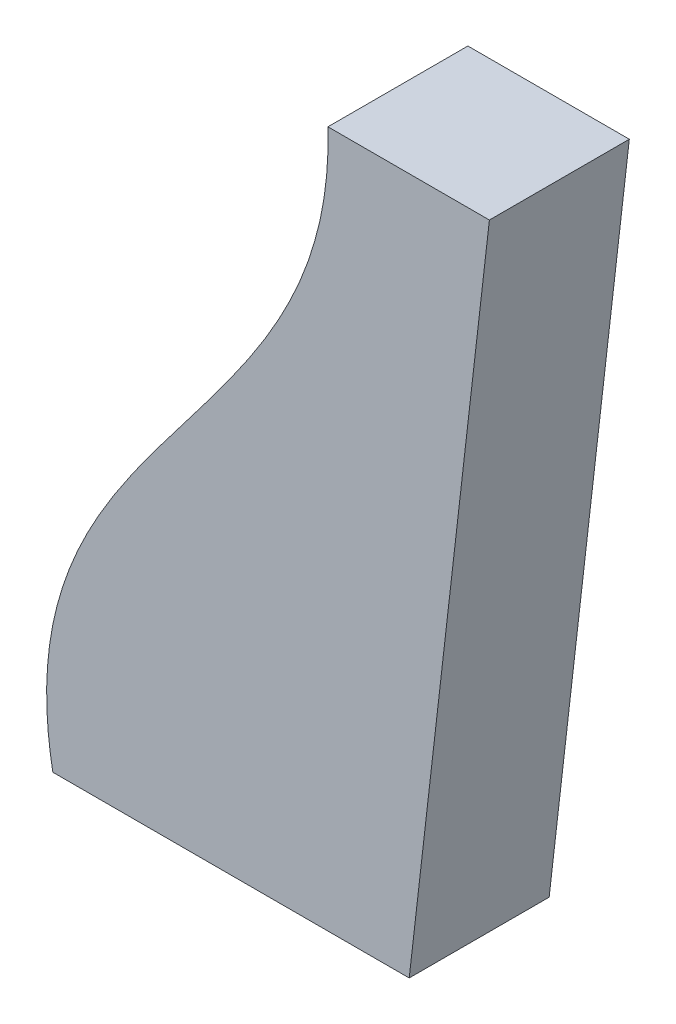
ISO-10303-21;
HEADER;
FILE_DESCRIPTION(('STEP AP214'),'2;1');
FILE_NAME('part.step','',(''),(''),'','','');
FILE_SCHEMA(('AUTOMOTIVE_DESIGN { 1 0 10303 214 1 1 1 1 }'));
ENDSEC;
DATA;
#1=APPLICATION_CONTEXT('core data for automotive mechanical design processes');
#2=APPLICATION_PROTOCOL_DEFINITION('international standard','automotive_design',2000,#1);
#3=PRODUCT_CONTEXT('',#1,'mechanical');
#4=PRODUCT('Part','Part','',(#3));
#5=PRODUCT_RELATED_PRODUCT_CATEGORY('part','',(#4));
#6=PRODUCT_DEFINITION_FORMATION('','',#4);
#7=PRODUCT_DEFINITION_CONTEXT('part definition',#1,'design');
#8=PRODUCT_DEFINITION('design','',#6,#7);
#9=PRODUCT_DEFINITION_SHAPE('','',#8);
#10=(LENGTH_UNIT() NAMED_UNIT(*) SI_UNIT(.MILLI.,.METRE.));
#11=(NAMED_UNIT(*) PLANE_ANGLE_UNIT() SI_UNIT($,.RADIAN.));
#12=(NAMED_UNIT(*) SI_UNIT($,.STERADIAN.) SOLID_ANGLE_UNIT());
#13=UNCERTAINTY_MEASURE_WITH_UNIT(LENGTH_MEASURE(1.E-05),#10,'distance_accuracy_value','');
#14=(GEOMETRIC_REPRESENTATION_CONTEXT(3) GLOBAL_UNCERTAINTY_ASSIGNED_CONTEXT((#13)) GLOBAL_UNIT_ASSIGNED_CONTEXT((#10,
#11,#12)) REPRESENTATION_CONTEXT('',''));
#15=CARTESIAN_POINT('',(0.,0.,0.));
#16=DIRECTION('',(0.,0.,1.));
#17=DIRECTION('',(1.,0.,0.));
#18=AXIS2_PLACEMENT_3D('',#15,#16,#17);
#19=CARTESIAN_POINT('',(11.7953608144515,29.8642555652806,6.));
#20=CARTESIAN_POINT('',(12.1785615995269,17.6111603074482,6.));
#21=CARTESIAN_POINT('',(-2.39517958167202,12.8139629050689,6.));
#22=CARTESIAN_POINT('',(0.,0.,6.));
#23=B_SPLINE_CURVE_WITH_KNOTS('',3,(#19,#20,#21,#22),.UNSPECIFIED.,.F.,.F.,(4,4),(0.,1.),.UNSPECIFIED.);
#24=DIRECTION('',(0.,0.,-1.));
#25=VECTOR('',#24,1.);
#26=SURFACE_OF_LINEAR_EXTRUSION('',#23,#25);
#27=CARTESIAN_POINT('',(11.7953608144515,29.8642555652806,0.));
#28=CARTESIAN_POINT('',(12.1785615995269,17.6111603074482,0.));
#29=CARTESIAN_POINT('',(-2.39517958167202,12.8139629050689,0.));
#30=CARTESIAN_POINT('',(0.,0.,0.));
#31=B_SPLINE_CURVE_WITH_KNOTS('',3,(#27,#28,#29,#30),.UNSPECIFIED.,.F.,.F.,(4,4),(0.,1.),.UNSPECIFIED.);
#32=CARTESIAN_POINT('',(11.7953608144515,29.8642555652806,0.));
#33=VERTEX_POINT('',#32);
#34=CARTESIAN_POINT('',(0.,0.,0.));
#35=VERTEX_POINT('',#34);
#36=EDGE_CURVE('E111',#33,#35,#31,.T.);
#37=ORIENTED_EDGE('',*,*,#36,.T.);
#38=DIRECTION('',(0.,0.,-1.));
#39=VECTOR('',#38,1.);
#40=CARTESIAN_POINT('',(0.,0.,6.));
#41=LINE('',#40,#39);
#42=CARTESIAN_POINT('',(0.,0.,6.));
#43=VERTEX_POINT('',#42);
#44=EDGE_CURVE('E11',#43,#35,#41,.T.);
#45=ORIENTED_EDGE('',*,*,#44,.F.);
#46=CARTESIAN_POINT('',(11.7953608144515,29.8642555652806,6.));
#47=VERTEX_POINT('',#46);
#48=EDGE_CURVE('E96',#47,#43,#23,.T.);
#49=ORIENTED_EDGE('',*,*,#48,.F.);
#50=DIRECTION('',(0.,0.,-1.));
#51=VECTOR('',#50,1.);
#52=CARTESIAN_POINT('',(11.7953608144515,29.8642555652806,6.));
#53=LINE('',#52,#51);
#54=EDGE_CURVE('E108',#47,#33,#53,.T.);
#55=ORIENTED_EDGE('',*,*,#54,.T.);
#56=EDGE_LOOP('',(#37,#45,#49,#55));
#57=FACE_BOUND('',#56,.T.);
#58=ADVANCED_FACE('F43',(#57),#26,.F.);
#59=CARTESIAN_POINT('',(15.2800290162487,0.,6.));
#60=DIRECTION('',(0.,1.,0.));
#61=DIRECTION('',(0.,0.,1.));
#62=AXIS2_PLACEMENT_3D('',#59,#60,#61);
#63=PLANE('',#62);
#64=DIRECTION('',(1.,0.,0.));
#65=VECTOR('',#64,1.);
#66=CARTESIAN_POINT('',(15.2800290162487,0.,0.));
#67=LINE('',#66,#65);
#68=CARTESIAN_POINT('',(15.2800290162487,0.,0.));
#69=VERTEX_POINT('',#68);
#70=EDGE_CURVE('E101',#35,#69,#67,.T.);
#71=ORIENTED_EDGE('',*,*,#70,.T.);
#72=DIRECTION('',(0.,0.,-1.));
#73=VECTOR('',#72,1.);
#74=CARTESIAN_POINT('',(15.2800290162487,0.,6.));
#75=LINE('',#74,#73);
#76=CARTESIAN_POINT('',(15.2800290162487,0.,6.));
#77=VERTEX_POINT('',#76);
#78=EDGE_CURVE('E53',#77,#69,#75,.T.);
#79=ORIENTED_EDGE('',*,*,#78,.F.);
#80=DIRECTION('',(1.,0.,0.));
#81=VECTOR('',#80,1.);
#82=CARTESIAN_POINT('',(15.2800290162487,0.,6.));
#83=LINE('',#82,#81);
#84=EDGE_CURVE('E91',#43,#77,#83,.T.);
#85=ORIENTED_EDGE('',*,*,#84,.F.);
#86=ORIENTED_EDGE('',*,*,#44,.T.);
#87=EDGE_LOOP('',(#71,#79,#85,#86));
#88=FACE_BOUND('',#87,.T.);
#89=ADVANCED_FACE('F100',(#88),#63,.F.);
#90=CARTESIAN_POINT('',(18.7178759977712,29.8642555652806,6.));
#91=DIRECTION('',(-0.993439312332918,0.114360538261667,0.));
#92=DIRECTION('',(-0.114360538261667,-0.993439312332918,0.));
#93=AXIS2_PLACEMENT_3D('',#90,#91,#92);
#94=PLANE('',#93);
#95=DIRECTION('',(0.114360538261667,0.993439312332918,0.));
#96=VECTOR('',#95,1.);
#97=CARTESIAN_POINT('',(18.7178759977712,29.8642555652806,0.));
#98=LINE('',#97,#96);
#99=CARTESIAN_POINT('',(18.7178759977712,29.8642555652806,0.));
#100=VERTEX_POINT('',#99);
#101=EDGE_CURVE('E78',#69,#100,#98,.T.);
#102=ORIENTED_EDGE('',*,*,#101,.T.);
#103=DIRECTION('',(0.,0.,-1.));
#104=VECTOR('',#103,1.);
#105=CARTESIAN_POINT('',(18.7178759977712,29.8642555652806,6.));
#106=LINE('',#105,#104);
#107=CARTESIAN_POINT('',(18.7178759977712,29.8642555652806,6.));
#108=VERTEX_POINT('',#107);
#109=EDGE_CURVE('E103',#108,#100,#106,.T.);
#110=ORIENTED_EDGE('',*,*,#109,.F.);
#111=DIRECTION('',(0.114360538261667,0.993439312332918,0.));
#112=VECTOR('',#111,1.);
#113=CARTESIAN_POINT('',(18.7178759977712,29.8642555652806,6.));
#114=LINE('',#113,#112);
#115=EDGE_CURVE('E94',#77,#108,#114,.T.);
#116=ORIENTED_EDGE('',*,*,#115,.F.);
#117=ORIENTED_EDGE('',*,*,#78,.T.);
#118=EDGE_LOOP('',(#102,#110,#116,#117));
#119=FACE_BOUND('',#118,.T.);
#120=ADVANCED_FACE('F104',(#119),#94,.F.);
#121=CARTESIAN_POINT('',(11.7953608144515,29.8642555652806,6.));
#122=DIRECTION('',(0.,-1.,0.));
#123=DIRECTION('',(0.,0.,-1.));
#124=AXIS2_PLACEMENT_3D('',#121,#122,#123);
#125=PLANE('',#124);
#126=DIRECTION('',(-1.,0.,0.));
#127=VECTOR('',#126,1.);
#128=CARTESIAN_POINT('',(11.7953608144515,29.8642555652806,0.));
#129=LINE('',#128,#127);
#130=EDGE_CURVE('E84',#100,#33,#129,.T.);
#131=ORIENTED_EDGE('',*,*,#130,.T.);
#132=ORIENTED_EDGE('',*,*,#54,.F.);
#133=DIRECTION('',(-1.,0.,0.));
#134=VECTOR('',#133,1.);
#135=CARTESIAN_POINT('',(11.7953608144515,29.8642555652806,6.));
#136=LINE('',#135,#134);
#137=EDGE_CURVE('E61',#108,#47,#136,.T.);
#138=ORIENTED_EDGE('',*,*,#137,.F.);
#139=ORIENTED_EDGE('',*,*,#109,.T.);
#140=EDGE_LOOP('',(#131,#132,#138,#139));
#141=FACE_BOUND('',#140,.T.);
#142=ADVANCED_FACE('F129',(#141),#125,.F.);
#143=CARTESIAN_POINT('',(5.14318835850201,15.142453150354,6.));
#144=DIRECTION('',(0.,0.,1.));
#145=DIRECTION('',(1.,0.,0.));
#146=AXIS2_PLACEMENT_3D('',#143,#144,#145);
#147=PLANE('',#146);
#148=ORIENTED_EDGE('',*,*,#48,.T.);
#149=ORIENTED_EDGE('',*,*,#84,.T.);
#150=ORIENTED_EDGE('',*,*,#115,.T.);
#151=ORIENTED_EDGE('',*,*,#137,.T.);
#152=EDGE_LOOP('',(#148,#149,#150,#151));
#153=FACE_BOUND('',#152,.T.);
#154=ADVANCED_FACE('F92',(#153),#147,.T.);
#155=CARTESIAN_POINT('',(5.14318835850201,15.142453150354,0.));
#156=DIRECTION('',(0.,0.,1.));
#157=DIRECTION('',(1.,0.,0.));
#158=AXIS2_PLACEMENT_3D('',#155,#156,#157);
#159=PLANE('',#158);
#160=ORIENTED_EDGE('',*,*,#36,.F.);
#161=ORIENTED_EDGE('',*,*,#130,.F.);
#162=ORIENTED_EDGE('',*,*,#101,.F.);
#163=ORIENTED_EDGE('',*,*,#70,.F.);
#164=EDGE_LOOP('',(#160,#161,#162,#163));
#165=FACE_BOUND('',#164,.T.);
#166=ADVANCED_FACE('F132',(#165),#159,.F.);
#167=CLOSED_SHELL('',(#58,#89,#120,#142,#154,#166));
#168=MANIFOLD_SOLID_BREP('B2',#167);
#169=ADVANCED_BREP_SHAPE_REPRESENTATION('',(#18,#168),#14);
#170=SHAPE_DEFINITION_REPRESENTATION(#9,#169);
ENDSEC;
END-ISO-10303-21;
